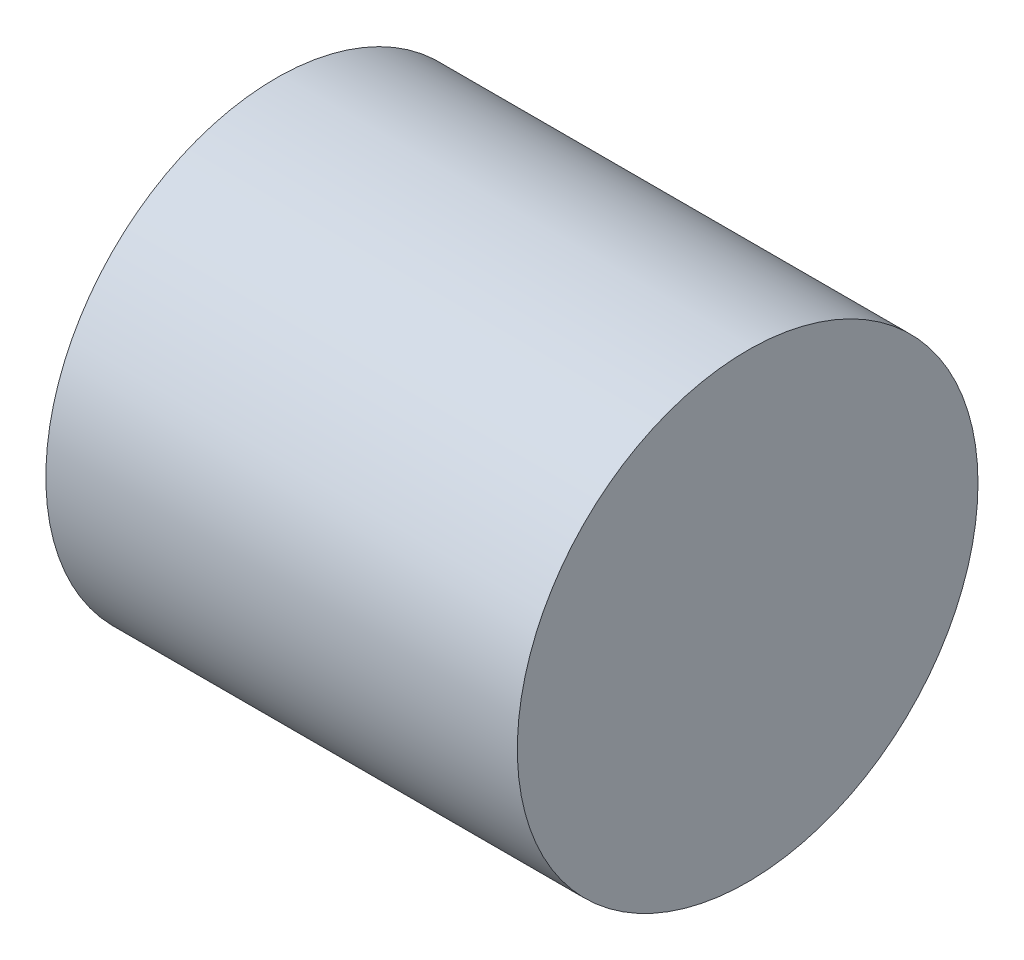
ISO-10303-21;
HEADER;
FILE_DESCRIPTION(('STEP AP214'),'2;1');
FILE_NAME('part.step','',(''),(''),'','','');
FILE_SCHEMA(('AUTOMOTIVE_DESIGN { 1 0 10303 214 1 1 1 1 }'));
ENDSEC;
DATA;
#1=APPLICATION_CONTEXT('core data for automotive mechanical design processes');
#2=APPLICATION_PROTOCOL_DEFINITION('international standard','automotive_design',2000,#1);
#3=PRODUCT_CONTEXT('',#1,'mechanical');
#4=PRODUCT('Part','Part','',(#3));
#5=PRODUCT_RELATED_PRODUCT_CATEGORY('part','',(#4));
#6=PRODUCT_DEFINITION_FORMATION('','',#4);
#7=PRODUCT_DEFINITION_CONTEXT('part definition',#1,'design');
#8=PRODUCT_DEFINITION('design','',#6,#7);
#9=PRODUCT_DEFINITION_SHAPE('','',#8);
#10=(LENGTH_UNIT() NAMED_UNIT(*) SI_UNIT(.MILLI.,.METRE.));
#11=(NAMED_UNIT(*) PLANE_ANGLE_UNIT() SI_UNIT($,.RADIAN.));
#12=(NAMED_UNIT(*) SI_UNIT($,.STERADIAN.) SOLID_ANGLE_UNIT());
#13=UNCERTAINTY_MEASURE_WITH_UNIT(LENGTH_MEASURE(1.E-05),#10,'distance_accuracy_value','');
#14=(GEOMETRIC_REPRESENTATION_CONTEXT(3) GLOBAL_UNCERTAINTY_ASSIGNED_CONTEXT((#13)) GLOBAL_UNIT_ASSIGNED_CONTEXT((#10,
#11,#12)) REPRESENTATION_CONTEXT('',''));
#15=CARTESIAN_POINT('',(0.,0.,0.));
#16=DIRECTION('',(0.,0.,1.));
#17=DIRECTION('',(1.,0.,0.));
#18=AXIS2_PLACEMENT_3D('',#15,#16,#17);
#19=CARTESIAN_POINT('',(11.731,-9.173,-17.391));
#20=DIRECTION('',(-1.,0.,0.));
#21=DIRECTION('',(0.,0.,1.));
#22=AXIS2_PLACEMENT_3D('',#19,#20,#21);
#23=CYLINDRICAL_SURFACE('',#22,5.731);
#24=CARTESIAN_POINT('',(11.731,-9.173,-17.391));
#25=DIRECTION('',(1.,0.,0.));
#26=DIRECTION('',(0.,0.,-1.));
#27=AXIS2_PLACEMENT_3D('',#24,#25,#26);
#28=CIRCLE('',#27,5.731);
#29=CARTESIAN_POINT('',(11.731,-9.173,-23.122));
#30=VERTEX_POINT('',#29);
#31=EDGE_CURVE('E10',#30,#30,#28,.T.);
#32=ORIENTED_EDGE('',*,*,#31,.F.);
#33=EDGE_LOOP('',(#32));
#34=FACE_BOUND('',#33,.T.);
#35=CARTESIAN_POINT('',(0.,-9.173,-17.391));
#36=DIRECTION('',(1.,0.,0.));
#37=DIRECTION('',(0.,0.,-1.));
#38=AXIS2_PLACEMENT_3D('',#35,#36,#37);
#39=CIRCLE('',#38,5.731);
#40=CARTESIAN_POINT('',(0.,-9.173,-23.122));
#41=VERTEX_POINT('',#40);
#42=EDGE_CURVE('E45',#41,#41,#39,.T.);
#43=ORIENTED_EDGE('',*,*,#42,.T.);
#44=EDGE_LOOP('',(#43));
#45=FACE_BOUND('',#44,.T.);
#46=ADVANCED_FACE('F39',(#34,#45),#23,.T.);
#47=CARTESIAN_POINT('',(11.731,-9.173,-17.391));
#48=DIRECTION('',(1.,0.,0.));
#49=DIRECTION('',(0.,0.,-1.));
#50=AXIS2_PLACEMENT_3D('',#47,#48,#49);
#51=PLANE('',#50);
#52=ORIENTED_EDGE('',*,*,#31,.T.);
#53=EDGE_LOOP('',(#52));
#54=FACE_BOUND('',#53,.T.);
#55=ADVANCED_FACE('F53',(#54),#51,.T.);
#56=CARTESIAN_POINT('',(0.,-9.173,-17.391));
#57=DIRECTION('',(1.,0.,0.));
#58=DIRECTION('',(0.,0.,-1.));
#59=AXIS2_PLACEMENT_3D('',#56,#57,#58);
#60=PLANE('',#59);
#61=ORIENTED_EDGE('',*,*,#42,.F.);
#62=EDGE_LOOP('',(#61));
#63=FACE_BOUND('',#62,.T.);
#64=ADVANCED_FACE('F55',(#63),#60,.F.);
#65=CLOSED_SHELL('',(#46,#55,#64));
#66=MANIFOLD_SOLID_BREP('B2',#65);
#67=ADVANCED_BREP_SHAPE_REPRESENTATION('',(#18,#66),#14);
#68=SHAPE_DEFINITION_REPRESENTATION(#9,#67);
ENDSEC;
END-ISO-10303-21;
